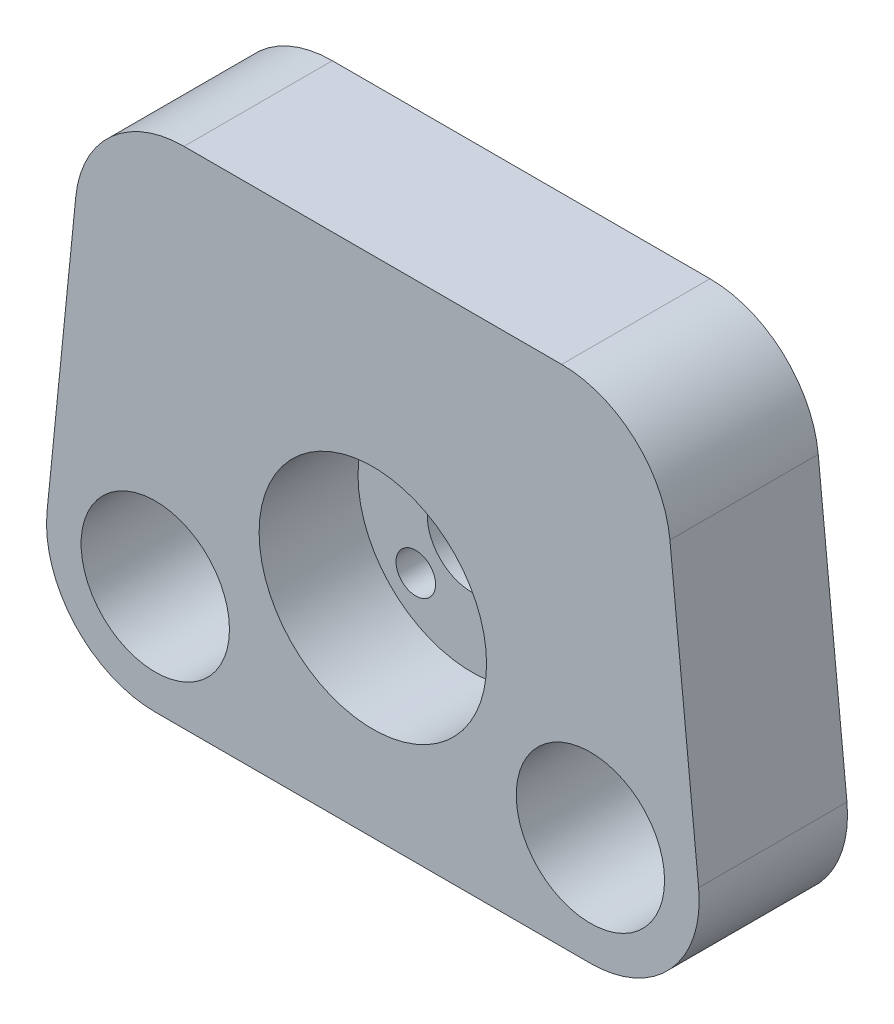
ISO-10303-21;
HEADER;
FILE_DESCRIPTION(('STEP AP214'),'2;1');
FILE_NAME('part.step','',(''),(''),'','','');
FILE_SCHEMA(('AUTOMOTIVE_DESIGN { 1 0 10303 214 1 1 1 1 }'));
ENDSEC;
DATA;
#1=APPLICATION_CONTEXT('core data for automotive mechanical design processes');
#2=APPLICATION_PROTOCOL_DEFINITION('international standard','automotive_design',2000,#1);
#3=PRODUCT_CONTEXT('',#1,'mechanical');
#4=PRODUCT('Part','Part','',(#3));
#5=PRODUCT_RELATED_PRODUCT_CATEGORY('part','',(#4));
#6=PRODUCT_DEFINITION_FORMATION('','',#4);
#7=PRODUCT_DEFINITION_CONTEXT('part definition',#1,'design');
#8=PRODUCT_DEFINITION('design','',#6,#7);
#9=PRODUCT_DEFINITION_SHAPE('','',#8);
#10=(LENGTH_UNIT() NAMED_UNIT(*) SI_UNIT(.MILLI.,.METRE.));
#11=(NAMED_UNIT(*) PLANE_ANGLE_UNIT() SI_UNIT($,.RADIAN.));
#12=(NAMED_UNIT(*) SI_UNIT($,.STERADIAN.) SOLID_ANGLE_UNIT());
#13=UNCERTAINTY_MEASURE_WITH_UNIT(LENGTH_MEASURE(1.E-05),#10,'distance_accuracy_value','');
#14=(GEOMETRIC_REPRESENTATION_CONTEXT(3) GLOBAL_UNCERTAINTY_ASSIGNED_CONTEXT((#13)) GLOBAL_UNIT_ASSIGNED_CONTEXT((#10,
#11,#12)) REPRESENTATION_CONTEXT('',''));
#15=CARTESIAN_POINT('',(0.,0.,0.));
#16=DIRECTION('',(0.,0.,1.));
#17=DIRECTION('',(1.,0.,0.));
#18=AXIS2_PLACEMENT_3D('',#15,#16,#17);
#19=CARTESIAN_POINT('',(0.,0.,15.));
#20=DIRECTION('',(0.,0.,-1.));
#21=DIRECTION('',(-1.,0.,0.));
#22=AXIS2_PLACEMENT_3D('',#19,#20,#21);
#23=CYLINDRICAL_SURFACE('',#22,4.5);
#24=CARTESIAN_POINT('',(0.,0.,0.));
#25=DIRECTION('',(0.,0.,1.));
#26=DIRECTION('',(1.,0.,0.));
#27=AXIS2_PLACEMENT_3D('',#24,#25,#26);
#28=CIRCLE('',#27,4.5);
#29=CARTESIAN_POINT('',(4.5,0.,0.));
#30=VERTEX_POINT('',#29);
#31=EDGE_CURVE('E195',#30,#30,#28,.T.);
#32=ORIENTED_EDGE('',*,*,#31,.F.);
#33=EDGE_LOOP('',(#32));
#34=FACE_BOUND('',#33,.T.);
#35=CARTESIAN_POINT('',(0.,0.,5.));
#36=DIRECTION('',(0.,0.,1.));
#37=DIRECTION('',(1.,0.,0.));
#38=AXIS2_PLACEMENT_3D('',#35,#36,#37);
#39=CIRCLE('',#38,4.5);
#40=CARTESIAN_POINT('',(4.5,0.,5.));
#41=VERTEX_POINT('',#40);
#42=EDGE_CURVE('E38',#41,#41,#39,.T.);
#43=ORIENTED_EDGE('',*,*,#42,.T.);
#44=EDGE_LOOP('',(#43));
#45=FACE_BOUND('',#44,.T.);
#46=ADVANCED_FACE('F34',(#34,#45),#23,.F.);
#47=CARTESIAN_POINT('',(0.,0.,15.));
#48=DIRECTION('',(0.,0.,-1.));
#49=DIRECTION('',(-1.,0.,0.));
#50=AXIS2_PLACEMENT_3D('',#47,#48,#49);
#51=PLANE('',#50);
#52=CARTESIAN_POINT('',(0.,0.,15.));
#53=DIRECTION('',(0.,0.,1.));
#54=DIRECTION('',(1.,0.,0.));
#55=AXIS2_PLACEMENT_3D('',#52,#53,#54);
#56=CIRCLE('',#55,11.5);
#57=CARTESIAN_POINT('',(11.5,0.,15.));
#58=VERTEX_POINT('',#57);
#59=EDGE_CURVE('E200',#58,#58,#56,.T.);
#60=ORIENTED_EDGE('',*,*,#59,.F.);
#61=EDGE_LOOP('',(#60));
#62=FACE_BOUND('',#61,.T.);
#63=DIRECTION('',(1.,0.,0.));
#64=VECTOR('',#63,1.);
#65=CARTESIAN_POINT('',(-34.1568807734127,-21.,15.));
#66=LINE('',#65,#64);
#67=CARTESIAN_POINT('',(-22.,-21.,15.));
#68=VERTEX_POINT('',#67);
#69=CARTESIAN_POINT('',(22.,-21.,15.));
#70=VERTEX_POINT('',#69);
#71=EDGE_CURVE('E140',#68,#70,#66,.T.);
#72=ORIENTED_EDGE('',*,*,#71,.T.);
#73=CARTESIAN_POINT('',(22.,-10.,15.));
#74=DIRECTION('',(0.,0.,-1.));
#75=DIRECTION('',(-1.,0.,0.));
#76=AXIS2_PLACEMENT_3D('',#73,#74,#75);
#77=CIRCLE('',#76,11.);
#78=CARTESIAN_POINT('',(32.9452281779525,-8.90365145480317,15.));
#79=VERTEX_POINT('',#78);
#80=EDGE_CURVE('E158',#70,#79,#77,.F.);
#81=ORIENTED_EDGE('',*,*,#80,.T.);
#82=DIRECTION('',(-0.0996680495633484,0.995020743450225,0.));
#83=VECTOR('',#82,1.);
#84=CARTESIAN_POINT('',(34.1568807734127,-21.,15.));
#85=LINE('',#84,#83);
#86=CARTESIAN_POINT('',(30.0403908101256,20.0963485451968,15.));
#87=VERTEX_POINT('',#86);
#88=EDGE_CURVE('E122',#79,#87,#85,.T.);
#89=ORIENTED_EDGE('',*,*,#88,.T.);
#90=CARTESIAN_POINT('',(19.0951626321731,19.,15.));
#91=DIRECTION('',(0.,0.,-1.));
#92=DIRECTION('',(-1.,0.,0.));
#93=AXIS2_PLACEMENT_3D('',#90,#91,#92);
#94=CIRCLE('',#93,11.);
#95=CARTESIAN_POINT('',(19.0951626321731,30.,15.));
#96=VERTEX_POINT('',#95);
#97=EDGE_CURVE('E154',#87,#96,#94,.F.);
#98=ORIENTED_EDGE('',*,*,#97,.T.);
#99=DIRECTION('',(-1.,0.,0.));
#100=VECTOR('',#99,1.);
#101=CARTESIAN_POINT('',(-29.0483736782689,30.,15.));
#102=LINE('',#101,#100);
#103=CARTESIAN_POINT('',(-19.0951626321731,30.,15.));
#104=VERTEX_POINT('',#103);
#105=EDGE_CURVE('E168',#96,#104,#102,.T.);
#106=ORIENTED_EDGE('',*,*,#105,.T.);
#107=CARTESIAN_POINT('',(-19.0951626321731,19.,15.));
#108=DIRECTION('',(0.,0.,-1.));
#109=DIRECTION('',(-1.,0.,0.));
#110=AXIS2_PLACEMENT_3D('',#107,#108,#109);
#111=CIRCLE('',#110,11.);
#112=CARTESIAN_POINT('',(-30.0403908101256,20.0963485451968,15.));
#113=VERTEX_POINT('',#112);
#114=EDGE_CURVE('E57',#104,#113,#111,.F.);
#115=ORIENTED_EDGE('',*,*,#114,.T.);
#116=DIRECTION('',(-0.0996680495633482,-0.995020743450225,0.));
#117=VECTOR('',#116,1.);
#118=CARTESIAN_POINT('',(-34.1568807734127,-21.,15.));
#119=LINE('',#118,#117);
#120=CARTESIAN_POINT('',(-32.9452281779525,-8.90365145480317,15.));
#121=VERTEX_POINT('',#120);
#122=EDGE_CURVE('E175',#113,#121,#119,.T.);
#123=ORIENTED_EDGE('',*,*,#122,.T.);
#124=CARTESIAN_POINT('',(-22.,-10.,15.));
#125=DIRECTION('',(0.,0.,-1.));
#126=DIRECTION('',(-1.,0.,0.));
#127=AXIS2_PLACEMENT_3D('',#124,#125,#126);
#128=CIRCLE('',#127,11.);
#129=EDGE_CURVE('E156',#121,#68,#128,.F.);
#130=ORIENTED_EDGE('',*,*,#129,.T.);
#131=EDGE_LOOP('',(#72,#81,#89,#98,#106,#115,#123,#130));
#132=FACE_BOUND('',#131,.T.);
#133=CARTESIAN_POINT('',(22.,-10.,15.));
#134=DIRECTION('',(0.,0.,1.));
#135=DIRECTION('',(1.,0.,0.));
#136=AXIS2_PLACEMENT_3D('',#133,#134,#135);
#137=CIRCLE('',#136,7.5);
#138=CARTESIAN_POINT('',(29.5,-10.,15.));
#139=VERTEX_POINT('',#138);
#140=EDGE_CURVE('E131',#139,#139,#137,.T.);
#141=ORIENTED_EDGE('',*,*,#140,.F.);
#142=EDGE_LOOP('',(#141));
#143=FACE_BOUND('',#142,.T.);
#144=CARTESIAN_POINT('',(-22.,-10.,15.));
#145=DIRECTION('',(0.,0.,1.));
#146=DIRECTION('',(1.,0.,0.));
#147=AXIS2_PLACEMENT_3D('',#144,#145,#146);
#148=CIRCLE('',#147,7.5);
#149=CARTESIAN_POINT('',(-14.5,-10.,15.));
#150=VERTEX_POINT('',#149);
#151=EDGE_CURVE('E190',#150,#150,#148,.T.);
#152=ORIENTED_EDGE('',*,*,#151,.F.);
#153=EDGE_LOOP('',(#152));
#154=FACE_BOUND('',#153,.T.);
#155=ADVANCED_FACE('F172',(#62,#132,#143,#154),#51,.F.);
#156=CARTESIAN_POINT('',(0.,0.,0.));
#157=DIRECTION('',(0.,0.,-1.));
#158=DIRECTION('',(-1.,0.,0.));
#159=AXIS2_PLACEMENT_3D('',#156,#157,#158);
#160=PLANE('',#159);
#161=CARTESIAN_POINT('',(-5.65685424949233,5.65685424949243,0.));
#162=DIRECTION('',(0.,0.,-1.));
#163=DIRECTION('',(-1.,0.,0.));
#164=AXIS2_PLACEMENT_3D('',#161,#162,#163);
#165=CIRCLE('',#164,2.);
#166=CARTESIAN_POINT('',(-7.65685424949233,5.65685424949243,0.));
#167=VERTEX_POINT('',#166);
#168=EDGE_CURVE('E227',#167,#167,#165,.T.);
#169=ORIENTED_EDGE('',*,*,#168,.F.);
#170=EDGE_LOOP('',(#169));
#171=FACE_BOUND('',#170,.T.);
#172=CARTESIAN_POINT('',(-5.65685424949237,-5.65685424949239,0.));
#173=DIRECTION('',(0.,0.,-1.));
#174=DIRECTION('',(-1.,0.,0.));
#175=AXIS2_PLACEMENT_3D('',#172,#173,#174);
#176=CIRCLE('',#175,2.);
#177=CARTESIAN_POINT('',(-7.65685424949237,-5.65685424949239,0.));
#178=VERTEX_POINT('',#177);
#179=EDGE_CURVE('E221',#178,#178,#176,.T.);
#180=ORIENTED_EDGE('',*,*,#179,.F.);
#181=EDGE_LOOP('',(#180));
#182=FACE_BOUND('',#181,.T.);
#183=CARTESIAN_POINT('',(5.65685424949237,-5.65685424949239,0.));
#184=DIRECTION('',(0.,0.,-1.));
#185=DIRECTION('',(-1.,0.,0.));
#186=AXIS2_PLACEMENT_3D('',#183,#184,#185);
#187=CIRCLE('',#186,2.);
#188=CARTESIAN_POINT('',(3.65685424949237,-5.65685424949239,0.));
#189=VERTEX_POINT('',#188);
#190=EDGE_CURVE('E215',#189,#189,#187,.T.);
#191=ORIENTED_EDGE('',*,*,#190,.F.);
#192=EDGE_LOOP('',(#191));
#193=FACE_BOUND('',#192,.T.);
#194=CARTESIAN_POINT('',(5.65685424949237,5.65685424949239,0.));
#195=DIRECTION('',(0.,0.,-1.));
#196=DIRECTION('',(-1.,0.,0.));
#197=AXIS2_PLACEMENT_3D('',#194,#195,#196);
#198=CIRCLE('',#197,2.);
#199=CARTESIAN_POINT('',(3.65685424949237,5.65685424949239,0.));
#200=VERTEX_POINT('',#199);
#201=EDGE_CURVE('E209',#200,#200,#198,.T.);
#202=ORIENTED_EDGE('',*,*,#201,.F.);
#203=EDGE_LOOP('',(#202));
#204=FACE_BOUND('',#203,.T.);
#205=CARTESIAN_POINT('',(-22.,-10.,0.));
#206=DIRECTION('',(0.,0.,1.));
#207=DIRECTION('',(1.,0.,0.));
#208=AXIS2_PLACEMENT_3D('',#205,#206,#207);
#209=CIRCLE('',#208,7.5);
#210=CARTESIAN_POINT('',(-14.5,-10.,0.));
#211=VERTEX_POINT('',#210);
#212=EDGE_CURVE('E192',#211,#211,#209,.T.);
#213=ORIENTED_EDGE('',*,*,#212,.T.);
#214=EDGE_LOOP('',(#213));
#215=FACE_BOUND('',#214,.T.);
#216=DIRECTION('',(-0.0996680495633484,0.995020743450225,0.));
#217=VECTOR('',#216,1.);
#218=CARTESIAN_POINT('',(34.1568807734127,-21.,0.));
#219=LINE('',#218,#217);
#220=CARTESIAN_POINT('',(32.9452281779525,-8.90365145480317,0.));
#221=VERTEX_POINT('',#220);
#222=CARTESIAN_POINT('',(30.0403908101256,20.0963485451968,0.));
#223=VERTEX_POINT('',#222);
#224=EDGE_CURVE('E119',#221,#223,#219,.T.);
#225=ORIENTED_EDGE('',*,*,#224,.F.);
#226=CARTESIAN_POINT('',(22.,-10.,0.));
#227=DIRECTION('',(0.,0.,-1.));
#228=DIRECTION('',(-1.,0.,0.));
#229=AXIS2_PLACEMENT_3D('',#226,#227,#228);
#230=CIRCLE('',#229,11.);
#231=CARTESIAN_POINT('',(22.,-21.,0.));
#232=VERTEX_POINT('',#231);
#233=EDGE_CURVE('E102',#221,#232,#230,.T.);
#234=ORIENTED_EDGE('',*,*,#233,.T.);
#235=DIRECTION('',(1.,0.,0.));
#236=VECTOR('',#235,1.);
#237=CARTESIAN_POINT('',(-34.1568807734127,-21.,0.));
#238=LINE('',#237,#236);
#239=CARTESIAN_POINT('',(-22.,-21.,0.));
#240=VERTEX_POINT('',#239);
#241=EDGE_CURVE('E144',#240,#232,#238,.T.);
#242=ORIENTED_EDGE('',*,*,#241,.F.);
#243=CARTESIAN_POINT('',(-22.,-10.,0.));
#244=DIRECTION('',(0.,0.,-1.));
#245=DIRECTION('',(-1.,0.,0.));
#246=AXIS2_PLACEMENT_3D('',#243,#244,#245);
#247=CIRCLE('',#246,11.);
#248=CARTESIAN_POINT('',(-32.9452281779525,-8.90365145480317,0.));
#249=VERTEX_POINT('',#248);
#250=EDGE_CURVE('E113',#240,#249,#247,.T.);
#251=ORIENTED_EDGE('',*,*,#250,.T.);
#252=DIRECTION('',(-0.0996680495633482,-0.995020743450225,0.));
#253=VECTOR('',#252,1.);
#254=CARTESIAN_POINT('',(-34.1568807734127,-21.,0.));
#255=LINE('',#254,#253);
#256=CARTESIAN_POINT('',(-30.0403908101256,20.0963485451968,0.));
#257=VERTEX_POINT('',#256);
#258=EDGE_CURVE('E134',#257,#249,#255,.T.);
#259=ORIENTED_EDGE('',*,*,#258,.F.);
#260=CARTESIAN_POINT('',(-19.0951626321731,19.,0.));
#261=DIRECTION('',(0.,0.,-1.));
#262=DIRECTION('',(-1.,0.,0.));
#263=AXIS2_PLACEMENT_3D('',#260,#261,#262);
#264=CIRCLE('',#263,11.);
#265=CARTESIAN_POINT('',(-19.0951626321731,30.,0.));
#266=VERTEX_POINT('',#265);
#267=EDGE_CURVE('E123',#257,#266,#264,.T.);
#268=ORIENTED_EDGE('',*,*,#267,.T.);
#269=DIRECTION('',(-1.,0.,0.));
#270=VECTOR('',#269,1.);
#271=CARTESIAN_POINT('',(-29.0483736782689,30.,0.));
#272=LINE('',#271,#270);
#273=CARTESIAN_POINT('',(19.0951626321731,30.,0.));
#274=VERTEX_POINT('',#273);
#275=EDGE_CURVE('E130',#274,#266,#272,.T.);
#276=ORIENTED_EDGE('',*,*,#275,.F.);
#277=CARTESIAN_POINT('',(19.0951626321731,19.,0.));
#278=DIRECTION('',(0.,0.,-1.));
#279=DIRECTION('',(-1.,0.,0.));
#280=AXIS2_PLACEMENT_3D('',#277,#278,#279);
#281=CIRCLE('',#280,11.);
#282=EDGE_CURVE('E129',#274,#223,#281,.T.);
#283=ORIENTED_EDGE('',*,*,#282,.T.);
#284=EDGE_LOOP('',(#225,#234,#242,#251,#259,#268,#276,#283));
#285=FACE_BOUND('',#284,.T.);
#286=CARTESIAN_POINT('',(22.,-10.,0.));
#287=DIRECTION('',(0.,0.,1.));
#288=DIRECTION('',(1.,0.,0.));
#289=AXIS2_PLACEMENT_3D('',#286,#287,#288);
#290=CIRCLE('',#289,7.5);
#291=CARTESIAN_POINT('',(29.5,-10.,0.));
#292=VERTEX_POINT('',#291);
#293=EDGE_CURVE('E137',#292,#292,#290,.T.);
#294=ORIENTED_EDGE('',*,*,#293,.T.);
#295=EDGE_LOOP('',(#294));
#296=FACE_BOUND('',#295,.T.);
#297=ORIENTED_EDGE('',*,*,#31,.T.);
#298=EDGE_LOOP('',(#297));
#299=FACE_BOUND('',#298,.T.);
#300=ADVANCED_FACE('F126',(#171,#182,#193,#204,#215,#285,#296,#299),#160,.T.);
#301=CARTESIAN_POINT('',(34.1568807734127,-21.,15.));
#302=DIRECTION('',(-0.995020743450225,-0.0996680495633484,0.));
#303=DIRECTION('',(0.0996680495633484,-0.995020743450225,0.));
#304=AXIS2_PLACEMENT_3D('',#301,#302,#303);
#305=PLANE('',#304);
#306=ORIENTED_EDGE('',*,*,#88,.F.);
#307=DIRECTION('',(0.,0.,-1.));
#308=VECTOR('',#307,1.);
#309=CARTESIAN_POINT('',(32.9452281779525,-8.90365145480317,15.));
#310=LINE('',#309,#308);
#311=EDGE_CURVE('E106',#79,#221,#310,.T.);
#312=ORIENTED_EDGE('',*,*,#311,.T.);
#313=ORIENTED_EDGE('',*,*,#224,.T.);
#314=DIRECTION('',(0.,0.,-1.));
#315=VECTOR('',#314,1.);
#316=CARTESIAN_POINT('',(30.0403908101256,20.0963485451968,15.));
#317=LINE('',#316,#315);
#318=EDGE_CURVE('E124',#223,#87,#317,.F.);
#319=ORIENTED_EDGE('',*,*,#318,.T.);
#320=EDGE_LOOP('',(#306,#312,#313,#319));
#321=FACE_BOUND('',#320,.T.);
#322=ADVANCED_FACE('F118',(#321),#305,.F.);
#323=CARTESIAN_POINT('',(-29.0483736782689,30.,15.));
#324=DIRECTION('',(0.,-1.,0.));
#325=DIRECTION('',(0.,0.,-1.));
#326=AXIS2_PLACEMENT_3D('',#323,#324,#325);
#327=PLANE('',#326);
#328=ORIENTED_EDGE('',*,*,#105,.F.);
#329=DIRECTION('',(0.,0.,-1.));
#330=VECTOR('',#329,1.);
#331=CARTESIAN_POINT('',(19.0951626321731,30.,15.));
#332=LINE('',#331,#330);
#333=EDGE_CURVE('E11',#96,#274,#332,.T.);
#334=ORIENTED_EDGE('',*,*,#333,.T.);
#335=ORIENTED_EDGE('',*,*,#275,.T.);
#336=DIRECTION('',(0.,0.,-1.));
#337=VECTOR('',#336,1.);
#338=CARTESIAN_POINT('',(-19.0951626321731,30.,15.));
#339=LINE('',#338,#337);
#340=EDGE_CURVE('E43',#266,#104,#339,.F.);
#341=ORIENTED_EDGE('',*,*,#340,.T.);
#342=EDGE_LOOP('',(#328,#334,#335,#341));
#343=FACE_BOUND('',#342,.T.);
#344=ADVANCED_FACE('F167',(#343),#327,.F.);
#345=CARTESIAN_POINT('',(-34.1568807734127,-21.,15.));
#346=DIRECTION('',(0.995020743450225,-0.0996680495633482,0.));
#347=DIRECTION('',(0.0996680495633482,0.995020743450225,0.));
#348=AXIS2_PLACEMENT_3D('',#345,#346,#347);
#349=PLANE('',#348);
#350=ORIENTED_EDGE('',*,*,#258,.T.);
#351=DIRECTION('',(0.,0.,-1.));
#352=VECTOR('',#351,1.);
#353=CARTESIAN_POINT('',(-32.9452281779525,-8.90365145480317,15.));
#354=LINE('',#353,#352);
#355=EDGE_CURVE('E50',#249,#121,#354,.F.);
#356=ORIENTED_EDGE('',*,*,#355,.T.);
#357=ORIENTED_EDGE('',*,*,#122,.F.);
#358=DIRECTION('',(0.,0.,-1.));
#359=VECTOR('',#358,1.);
#360=CARTESIAN_POINT('',(-30.0403908101256,20.0963485451968,15.));
#361=LINE('',#360,#359);
#362=EDGE_CURVE('E160',#113,#257,#361,.T.);
#363=ORIENTED_EDGE('',*,*,#362,.T.);
#364=EDGE_LOOP('',(#350,#356,#357,#363));
#365=FACE_BOUND('',#364,.T.);
#366=ADVANCED_FACE('F179',(#365),#349,.F.);
#367=CARTESIAN_POINT('',(-34.1568807734127,-21.,15.));
#368=DIRECTION('',(0.,1.,0.));
#369=DIRECTION('',(0.,0.,1.));
#370=AXIS2_PLACEMENT_3D('',#367,#368,#369);
#371=PLANE('',#370);
#372=ORIENTED_EDGE('',*,*,#241,.T.);
#373=DIRECTION('',(0.,0.,-1.));
#374=VECTOR('',#373,1.);
#375=CARTESIAN_POINT('',(22.,-21.,15.));
#376=LINE('',#375,#374);
#377=EDGE_CURVE('E107',#232,#70,#376,.F.);
#378=ORIENTED_EDGE('',*,*,#377,.T.);
#379=ORIENTED_EDGE('',*,*,#71,.F.);
#380=DIRECTION('',(0.,0.,-1.));
#381=VECTOR('',#380,1.);
#382=CARTESIAN_POINT('',(-22.,-21.,15.));
#383=LINE('',#382,#381);
#384=EDGE_CURVE('E112',#68,#240,#383,.T.);
#385=ORIENTED_EDGE('',*,*,#384,.T.);
#386=EDGE_LOOP('',(#372,#378,#379,#385));
#387=FACE_BOUND('',#386,.T.);
#388=ADVANCED_FACE('F186',(#387),#371,.F.);
#389=CARTESIAN_POINT('',(22.,-10.,15.));
#390=DIRECTION('',(0.,0.,-1.));
#391=DIRECTION('',(-1.,0.,0.));
#392=AXIS2_PLACEMENT_3D('',#389,#390,#391);
#393=CYLINDRICAL_SURFACE('',#392,7.5);
#394=ORIENTED_EDGE('',*,*,#140,.T.);
#395=EDGE_LOOP('',(#394));
#396=FACE_BOUND('',#395,.T.);
#397=ORIENTED_EDGE('',*,*,#293,.F.);
#398=EDGE_LOOP('',(#397));
#399=FACE_BOUND('',#398,.T.);
#400=ADVANCED_FACE('F246',(#396,#399),#393,.F.);
#401=CARTESIAN_POINT('',(-22.,-10.,15.));
#402=DIRECTION('',(0.,0.,-1.));
#403=DIRECTION('',(-1.,0.,0.));
#404=AXIS2_PLACEMENT_3D('',#401,#402,#403);
#405=CYLINDRICAL_SURFACE('',#404,7.5);
#406=ORIENTED_EDGE('',*,*,#151,.T.);
#407=EDGE_LOOP('',(#406));
#408=FACE_BOUND('',#407,.T.);
#409=ORIENTED_EDGE('',*,*,#212,.F.);
#410=EDGE_LOOP('',(#409));
#411=FACE_BOUND('',#410,.T.);
#412=ADVANCED_FACE('F244',(#408,#411),#405,.F.);
#413=CARTESIAN_POINT('',(22.,-10.,15.));
#414=DIRECTION('',(0.,0.,-1.));
#415=DIRECTION('',(-1.,0.,0.));
#416=AXIS2_PLACEMENT_3D('',#413,#414,#415);
#417=CYLINDRICAL_SURFACE('',#416,11.);
#418=ORIENTED_EDGE('',*,*,#80,.F.);
#419=ORIENTED_EDGE('',*,*,#377,.F.);
#420=ORIENTED_EDGE('',*,*,#233,.F.);
#421=ORIENTED_EDGE('',*,*,#311,.F.);
#422=EDGE_LOOP('',(#418,#419,#420,#421));
#423=FACE_BOUND('',#422,.T.);
#424=ADVANCED_FACE('F105',(#423),#417,.T.);
#425=CARTESIAN_POINT('',(-22.,-10.,15.));
#426=DIRECTION('',(0.,0.,-1.));
#427=DIRECTION('',(-1.,0.,0.));
#428=AXIS2_PLACEMENT_3D('',#425,#426,#427);
#429=CYLINDRICAL_SURFACE('',#428,11.);
#430=ORIENTED_EDGE('',*,*,#129,.F.);
#431=ORIENTED_EDGE('',*,*,#355,.F.);
#432=ORIENTED_EDGE('',*,*,#250,.F.);
#433=ORIENTED_EDGE('',*,*,#384,.F.);
#434=EDGE_LOOP('',(#430,#431,#432,#433));
#435=FACE_BOUND('',#434,.T.);
#436=ADVANCED_FACE('F183',(#435),#429,.T.);
#437=CARTESIAN_POINT('',(19.0951626321731,19.,15.));
#438=DIRECTION('',(0.,0.,-1.));
#439=DIRECTION('',(-1.,0.,0.));
#440=AXIS2_PLACEMENT_3D('',#437,#438,#439);
#441=CYLINDRICAL_SURFACE('',#440,11.);
#442=ORIENTED_EDGE('',*,*,#97,.F.);
#443=ORIENTED_EDGE('',*,*,#318,.F.);
#444=ORIENTED_EDGE('',*,*,#282,.F.);
#445=ORIENTED_EDGE('',*,*,#333,.F.);
#446=EDGE_LOOP('',(#442,#443,#444,#445));
#447=FACE_BOUND('',#446,.T.);
#448=ADVANCED_FACE('F336',(#447),#441,.T.);
#449=CARTESIAN_POINT('',(-19.0951626321731,19.,15.));
#450=DIRECTION('',(0.,0.,-1.));
#451=DIRECTION('',(-1.,0.,0.));
#452=AXIS2_PLACEMENT_3D('',#449,#450,#451);
#453=CYLINDRICAL_SURFACE('',#452,11.);
#454=ORIENTED_EDGE('',*,*,#114,.F.);
#455=ORIENTED_EDGE('',*,*,#340,.F.);
#456=ORIENTED_EDGE('',*,*,#267,.F.);
#457=ORIENTED_EDGE('',*,*,#362,.F.);
#458=EDGE_LOOP('',(#454,#455,#456,#457));
#459=FACE_BOUND('',#458,.T.);
#460=ADVANCED_FACE('F36',(#459),#453,.T.);
#461=CARTESIAN_POINT('',(0.,0.,5.));
#462=DIRECTION('',(0.,0.,1.));
#463=DIRECTION('',(1.,0.,0.));
#464=AXIS2_PLACEMENT_3D('',#461,#462,#463);
#465=CYLINDRICAL_SURFACE('',#464,11.5);
#466=CARTESIAN_POINT('',(0.,0.,5.));
#467=DIRECTION('',(0.,0.,1.));
#468=DIRECTION('',(1.,0.,0.));
#469=AXIS2_PLACEMENT_3D('',#466,#467,#468);
#470=CIRCLE('',#469,11.5);
#471=CARTESIAN_POINT('',(11.5,0.,5.));
#472=VERTEX_POINT('',#471);
#473=EDGE_CURVE('E203',#472,#472,#470,.T.);
#474=ORIENTED_EDGE('',*,*,#473,.F.);
#475=EDGE_LOOP('',(#474));
#476=FACE_BOUND('',#475,.T.);
#477=ORIENTED_EDGE('',*,*,#59,.T.);
#478=EDGE_LOOP('',(#477));
#479=FACE_BOUND('',#478,.T.);
#480=ADVANCED_FACE('F267',(#476,#479),#465,.F.);
#481=CARTESIAN_POINT('',(0.,0.,5.));
#482=DIRECTION('',(0.,0.,1.));
#483=DIRECTION('',(1.,0.,0.));
#484=AXIS2_PLACEMENT_3D('',#481,#482,#483);
#485=PLANE('',#484);
#486=CARTESIAN_POINT('',(-5.65685424949233,5.65685424949243,5.));
#487=DIRECTION('',(0.,0.,1.));
#488=DIRECTION('',(1.,0.,0.));
#489=AXIS2_PLACEMENT_3D('',#486,#487,#488);
#490=CIRCLE('',#489,2.);
#491=CARTESIAN_POINT('',(-3.65685424949233,5.65685424949243,5.));
#492=VERTEX_POINT('',#491);
#493=EDGE_CURVE('E224',#492,#492,#490,.T.);
#494=ORIENTED_EDGE('',*,*,#493,.F.);
#495=EDGE_LOOP('',(#494));
#496=FACE_BOUND('',#495,.T.);
#497=CARTESIAN_POINT('',(-5.65685424949237,-5.65685424949239,5.));
#498=DIRECTION('',(0.,0.,1.));
#499=DIRECTION('',(1.,0.,0.));
#500=AXIS2_PLACEMENT_3D('',#497,#498,#499);
#501=CIRCLE('',#500,2.);
#502=CARTESIAN_POINT('',(-3.65685424949237,-5.65685424949239,5.));
#503=VERTEX_POINT('',#502);
#504=EDGE_CURVE('E218',#503,#503,#501,.T.);
#505=ORIENTED_EDGE('',*,*,#504,.F.);
#506=EDGE_LOOP('',(#505));
#507=FACE_BOUND('',#506,.T.);
#508=CARTESIAN_POINT('',(5.65685424949237,-5.65685424949239,5.));
#509=DIRECTION('',(0.,0.,1.));
#510=DIRECTION('',(1.,0.,0.));
#511=AXIS2_PLACEMENT_3D('',#508,#509,#510);
#512=CIRCLE('',#511,2.);
#513=CARTESIAN_POINT('',(7.65685424949237,-5.65685424949239,5.));
#514=VERTEX_POINT('',#513);
#515=EDGE_CURVE('E212',#514,#514,#512,.T.);
#516=ORIENTED_EDGE('',*,*,#515,.F.);
#517=EDGE_LOOP('',(#516));
#518=FACE_BOUND('',#517,.T.);
#519=CARTESIAN_POINT('',(5.65685424949237,5.65685424949239,5.));
#520=DIRECTION('',(0.,0.,1.));
#521=DIRECTION('',(1.,0.,0.));
#522=AXIS2_PLACEMENT_3D('',#519,#520,#521);
#523=CIRCLE('',#522,2.);
#524=CARTESIAN_POINT('',(7.65685424949237,5.65685424949239,5.));
#525=VERTEX_POINT('',#524);
#526=EDGE_CURVE('E204',#525,#525,#523,.T.);
#527=ORIENTED_EDGE('',*,*,#526,.F.);
#528=EDGE_LOOP('',(#527));
#529=FACE_BOUND('',#528,.T.);
#530=ORIENTED_EDGE('',*,*,#42,.F.);
#531=EDGE_LOOP('',(#530));
#532=FACE_BOUND('',#531,.T.);
#533=ORIENTED_EDGE('',*,*,#473,.T.);
#534=EDGE_LOOP('',(#533));
#535=FACE_BOUND('',#534,.T.);
#536=ADVANCED_FACE('F270',(#496,#507,#518,#529,#532,#535),#485,.T.);
#537=CARTESIAN_POINT('',(5.65685424949237,5.65685424949239,0.));
#538=DIRECTION('',(0.,0.,-1.));
#539=DIRECTION('',(-1.,0.,0.));
#540=AXIS2_PLACEMENT_3D('',#537,#538,#539);
#541=CYLINDRICAL_SURFACE('',#540,2.);
#542=ORIENTED_EDGE('',*,*,#526,.T.);
#543=EDGE_LOOP('',(#542));
#544=FACE_BOUND('',#543,.T.);
#545=ORIENTED_EDGE('',*,*,#201,.T.);
#546=EDGE_LOOP('',(#545));
#547=FACE_BOUND('',#546,.T.);
#548=ADVANCED_FACE('F274',(#544,#547),#541,.F.);
#549=CARTESIAN_POINT('',(5.65685424949237,-5.65685424949239,0.));
#550=DIRECTION('',(0.,0.,-1.));
#551=DIRECTION('',(-1.,0.,0.));
#552=AXIS2_PLACEMENT_3D('',#549,#550,#551);
#553=CYLINDRICAL_SURFACE('',#552,2.);
#554=ORIENTED_EDGE('',*,*,#515,.T.);
#555=EDGE_LOOP('',(#554));
#556=FACE_BOUND('',#555,.T.);
#557=ORIENTED_EDGE('',*,*,#190,.T.);
#558=EDGE_LOOP('',(#557));
#559=FACE_BOUND('',#558,.T.);
#560=ADVANCED_FACE('F278',(#556,#559),#553,.F.);
#561=CARTESIAN_POINT('',(-5.65685424949237,-5.65685424949239,0.));
#562=DIRECTION('',(0.,0.,-1.));
#563=DIRECTION('',(-1.,0.,0.));
#564=AXIS2_PLACEMENT_3D('',#561,#562,#563);
#565=CYLINDRICAL_SURFACE('',#564,2.);
#566=ORIENTED_EDGE('',*,*,#504,.T.);
#567=EDGE_LOOP('',(#566));
#568=FACE_BOUND('',#567,.T.);
#569=ORIENTED_EDGE('',*,*,#179,.T.);
#570=EDGE_LOOP('',(#569));
#571=FACE_BOUND('',#570,.T.);
#572=ADVANCED_FACE('F282',(#568,#571),#565,.F.);
#573=CARTESIAN_POINT('',(-5.65685424949233,5.65685424949243,0.));
#574=DIRECTION('',(0.,0.,-1.));
#575=DIRECTION('',(-1.,0.,0.));
#576=AXIS2_PLACEMENT_3D('',#573,#574,#575);
#577=CYLINDRICAL_SURFACE('',#576,2.);
#578=ORIENTED_EDGE('',*,*,#493,.T.);
#579=EDGE_LOOP('',(#578));
#580=FACE_BOUND('',#579,.T.);
#581=ORIENTED_EDGE('',*,*,#168,.T.);
#582=EDGE_LOOP('',(#581));
#583=FACE_BOUND('',#582,.T.);
#584=ADVANCED_FACE('F231',(#580,#583),#577,.F.);
#585=CLOSED_SHELL('',(#46,#155,#300,#322,#344,#366,#388,#400,#412,#424,#436,#448,#460,#480,#536,
#548,#560,#572,#584));
#586=MANIFOLD_SOLID_BREP('B2',#585);
#587=ADVANCED_BREP_SHAPE_REPRESENTATION('',(#18,#586),#14);
#588=SHAPE_DEFINITION_REPRESENTATION(#9,#587);
ENDSEC;
END-ISO-10303-21;
